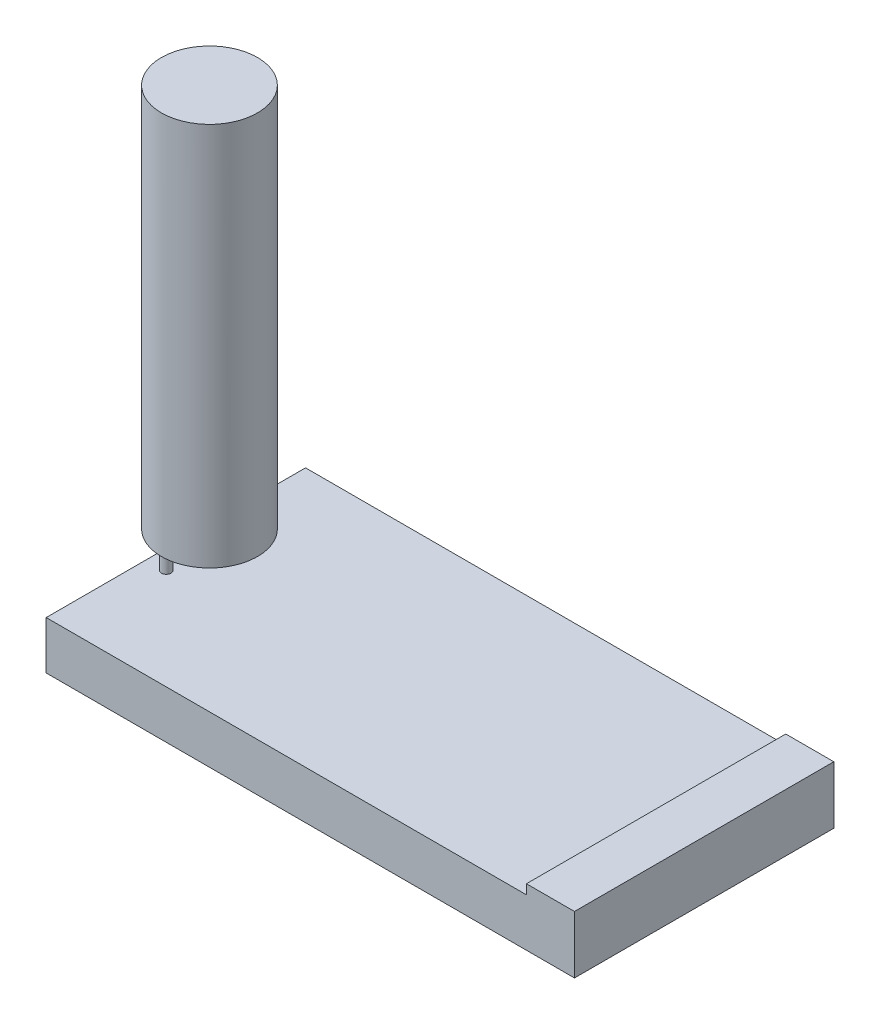
ISO-10303-21;
HEADER;
FILE_DESCRIPTION(('STEP AP214'),'2;1');
FILE_NAME('part.step','',(''),(''),'','','');
FILE_SCHEMA(('AUTOMOTIVE_DESIGN { 1 0 10303 214 1 1 1 1 }'));
ENDSEC;
DATA;
#1=APPLICATION_CONTEXT('core data for automotive mechanical design processes');
#2=APPLICATION_PROTOCOL_DEFINITION('international standard','automotive_design',2000,#1);
#3=PRODUCT_CONTEXT('',#1,'mechanical');
#4=PRODUCT('Part','Part','',(#3));
#5=PRODUCT_RELATED_PRODUCT_CATEGORY('part','',(#4));
#6=PRODUCT_DEFINITION_FORMATION('','',#4);
#7=PRODUCT_DEFINITION_CONTEXT('part definition',#1,'design');
#8=PRODUCT_DEFINITION('design','',#6,#7);
#9=PRODUCT_DEFINITION_SHAPE('','',#8);
#10=(LENGTH_UNIT() NAMED_UNIT(*) SI_UNIT(.MILLI.,.METRE.));
#11=(NAMED_UNIT(*) PLANE_ANGLE_UNIT() SI_UNIT($,.RADIAN.));
#12=(NAMED_UNIT(*) SI_UNIT($,.STERADIAN.) SOLID_ANGLE_UNIT());
#13=UNCERTAINTY_MEASURE_WITH_UNIT(LENGTH_MEASURE(1.E-05),#10,'distance_accuracy_value','');
#14=(GEOMETRIC_REPRESENTATION_CONTEXT(3) GLOBAL_UNCERTAINTY_ASSIGNED_CONTEXT((#13)) GLOBAL_UNIT_ASSIGNED_CONTEXT((#10,
#11,#12)) REPRESENTATION_CONTEXT('',''));
#15=CARTESIAN_POINT('',(0.,0.,0.));
#16=DIRECTION('',(0.,0.,1.));
#17=DIRECTION('',(1.,0.,0.));
#18=AXIS2_PLACEMENT_3D('',#15,#16,#17);
#19=CARTESIAN_POINT('',(13.75,2.5,6.75));
#20=DIRECTION('',(-1.,0.,0.));
#21=DIRECTION('',(0.,0.,1.));
#22=AXIS2_PLACEMENT_3D('',#19,#20,#21);
#23=PLANE('',#22);
#24=DIRECTION('',(0.,0.,-1.));
#25=VECTOR('',#24,1.);
#26=CARTESIAN_POINT('',(13.75,0.,6.75));
#27=LINE('',#26,#25);
#28=CARTESIAN_POINT('',(13.75,0.,6.75));
#29=VERTEX_POINT('',#28);
#30=CARTESIAN_POINT('',(13.75,0.,-6.75));
#31=VERTEX_POINT('',#30);
#32=EDGE_CURVE('E109',#29,#31,#27,.T.);
#33=ORIENTED_EDGE('',*,*,#32,.T.);
#34=DIRECTION('',(0.,-1.,0.));
#35=VECTOR('',#34,1.);
#36=CARTESIAN_POINT('',(13.75,2.5,-6.75));
#37=LINE('',#36,#35);
#38=CARTESIAN_POINT('',(13.75,3.,-6.75));
#39=VERTEX_POINT('',#38);
#40=EDGE_CURVE('E53',#39,#31,#37,.T.);
#41=ORIENTED_EDGE('',*,*,#40,.F.);
#42=DIRECTION('',(0.,0.,1.));
#43=VECTOR('',#42,1.);
#44=CARTESIAN_POINT('',(13.75,3.,0.));
#45=LINE('',#44,#43);
#46=CARTESIAN_POINT('',(13.75,3.,6.75));
#47=VERTEX_POINT('',#46);
#48=EDGE_CURVE('E111',#39,#47,#45,.T.);
#49=ORIENTED_EDGE('',*,*,#48,.T.);
#50=DIRECTION('',(0.,-1.,0.));
#51=VECTOR('',#50,1.);
#52=CARTESIAN_POINT('',(13.75,2.5,6.75));
#53=LINE('',#52,#51);
#54=EDGE_CURVE('E94',#47,#29,#53,.T.);
#55=ORIENTED_EDGE('',*,*,#54,.T.);
#56=EDGE_LOOP('',(#33,#41,#49,#55));
#57=FACE_BOUND('',#56,.T.);
#58=ADVANCED_FACE('F45',(#57),#23,.F.);
#59=CARTESIAN_POINT('',(-13.75,2.5,-6.75));
#60=DIRECTION('',(0.,0.,1.));
#61=DIRECTION('',(1.,0.,0.));
#62=AXIS2_PLACEMENT_3D('',#59,#60,#61);
#63=PLANE('',#62);
#64=DIRECTION('',(-1.,0.,0.));
#65=VECTOR('',#64,1.);
#66=CARTESIAN_POINT('',(-13.75,2.5,-6.75));
#67=LINE('',#66,#65);
#68=CARTESIAN_POINT('',(11.25,2.5,-6.75));
#69=VERTEX_POINT('',#68);
#70=CARTESIAN_POINT('',(-13.75,2.5,-6.75));
#71=VERTEX_POINT('',#70);
#72=EDGE_CURVE('E102',#69,#71,#67,.T.);
#73=ORIENTED_EDGE('',*,*,#72,.F.);
#74=DIRECTION('',(0.,-1.,0.));
#75=VECTOR('',#74,1.);
#76=CARTESIAN_POINT('',(11.25,3.,-6.75));
#77=LINE('',#76,#75);
#78=CARTESIAN_POINT('',(11.25,3.,-6.75));
#79=VERTEX_POINT('',#78);
#80=EDGE_CURVE('E60',#79,#69,#77,.T.);
#81=ORIENTED_EDGE('',*,*,#80,.F.);
#82=DIRECTION('',(1.,0.,0.));
#83=VECTOR('',#82,1.);
#84=CARTESIAN_POINT('',(0.,3.,-6.75));
#85=LINE('',#84,#83);
#86=EDGE_CURVE('E143',#79,#39,#85,.T.);
#87=ORIENTED_EDGE('',*,*,#86,.T.);
#88=ORIENTED_EDGE('',*,*,#40,.T.);
#89=DIRECTION('',(-1.,0.,0.));
#90=VECTOR('',#89,1.);
#91=CARTESIAN_POINT('',(-13.75,0.,-6.75));
#92=LINE('',#91,#90);
#93=CARTESIAN_POINT('',(-13.75,0.,-6.75));
#94=VERTEX_POINT('',#93);
#95=EDGE_CURVE('E116',#31,#94,#92,.T.);
#96=ORIENTED_EDGE('',*,*,#95,.T.);
#97=DIRECTION('',(0.,-1.,0.));
#98=VECTOR('',#97,1.);
#99=CARTESIAN_POINT('',(-13.75,2.5,-6.75));
#100=LINE('',#99,#98);
#101=EDGE_CURVE('E132',#71,#94,#100,.T.);
#102=ORIENTED_EDGE('',*,*,#101,.F.);
#103=EDGE_LOOP('',(#73,#81,#87,#88,#96,#102));
#104=FACE_BOUND('',#103,.T.);
#105=ADVANCED_FACE('F139',(#104),#63,.F.);
#106=CARTESIAN_POINT('',(-13.75,2.5,6.75));
#107=DIRECTION('',(1.,0.,0.));
#108=DIRECTION('',(0.,0.,-1.));
#109=AXIS2_PLACEMENT_3D('',#106,#107,#108);
#110=PLANE('',#109);
#111=DIRECTION('',(0.,0.,1.));
#112=VECTOR('',#111,1.);
#113=CARTESIAN_POINT('',(-13.75,0.,6.75));
#114=LINE('',#113,#112);
#115=CARTESIAN_POINT('',(-13.75,0.,6.75));
#116=VERTEX_POINT('',#115);
#117=EDGE_CURVE('E103',#94,#116,#114,.T.);
#118=ORIENTED_EDGE('',*,*,#117,.T.);
#119=DIRECTION('',(0.,-1.,0.));
#120=VECTOR('',#119,1.);
#121=CARTESIAN_POINT('',(-13.75,2.5,6.75));
#122=LINE('',#121,#120);
#123=CARTESIAN_POINT('',(-13.75,2.5,6.75));
#124=VERTEX_POINT('',#123);
#125=EDGE_CURVE('E97',#124,#116,#122,.T.);
#126=ORIENTED_EDGE('',*,*,#125,.F.);
#127=DIRECTION('',(0.,0.,1.));
#128=VECTOR('',#127,1.);
#129=CARTESIAN_POINT('',(-13.75,2.5,6.75));
#130=LINE('',#129,#128);
#131=EDGE_CURVE('E69',#71,#124,#130,.T.);
#132=ORIENTED_EDGE('',*,*,#131,.F.);
#133=ORIENTED_EDGE('',*,*,#101,.T.);
#134=EDGE_LOOP('',(#118,#126,#132,#133));
#135=FACE_BOUND('',#134,.T.);
#136=ADVANCED_FACE('F215',(#135),#110,.F.);
#137=CARTESIAN_POINT('',(-13.75,2.5,6.75));
#138=DIRECTION('',(0.,0.,-1.));
#139=DIRECTION('',(-1.,0.,0.));
#140=AXIS2_PLACEMENT_3D('',#137,#138,#139);
#141=PLANE('',#140);
#142=DIRECTION('',(1.,0.,0.));
#143=VECTOR('',#142,1.);
#144=CARTESIAN_POINT('',(-13.75,0.,6.75));
#145=LINE('',#144,#143);
#146=EDGE_CURVE('E89',#116,#29,#145,.T.);
#147=ORIENTED_EDGE('',*,*,#146,.T.);
#148=ORIENTED_EDGE('',*,*,#54,.F.);
#149=DIRECTION('',(-1.,0.,0.));
#150=VECTOR('',#149,1.);
#151=CARTESIAN_POINT('',(0.,3.,6.75));
#152=LINE('',#151,#150);
#153=CARTESIAN_POINT('',(11.25,3.,6.75));
#154=VERTEX_POINT('',#153);
#155=EDGE_CURVE('E155',#47,#154,#152,.T.);
#156=ORIENTED_EDGE('',*,*,#155,.T.);
#157=DIRECTION('',(0.,-1.,0.));
#158=VECTOR('',#157,1.);
#159=CARTESIAN_POINT('',(11.25,3.,6.75));
#160=LINE('',#159,#158);
#161=CARTESIAN_POINT('',(11.25,2.5,6.75));
#162=VERTEX_POINT('',#161);
#163=EDGE_CURVE('E153',#154,#162,#160,.T.);
#164=ORIENTED_EDGE('',*,*,#163,.T.);
#165=DIRECTION('',(1.,0.,0.));
#166=VECTOR('',#165,1.);
#167=CARTESIAN_POINT('',(-13.75,2.5,6.75));
#168=LINE('',#167,#166);
#169=EDGE_CURVE('E113',#124,#162,#168,.T.);
#170=ORIENTED_EDGE('',*,*,#169,.F.);
#171=ORIENTED_EDGE('',*,*,#125,.T.);
#172=EDGE_LOOP('',(#147,#148,#156,#164,#170,#171));
#173=FACE_BOUND('',#172,.T.);
#174=ADVANCED_FACE('F91',(#173),#141,.F.);
#175=CARTESIAN_POINT('',(0.,2.5,0.));
#176=DIRECTION('',(0.,-1.,0.));
#177=DIRECTION('',(0.,0.,-1.));
#178=AXIS2_PLACEMENT_3D('',#175,#176,#177);
#179=PLANE('',#178);
#180=CARTESIAN_POINT('',(-12.75,2.5,1.5));
#181=DIRECTION('',(0.,-1.,0.));
#182=DIRECTION('',(0.,0.,-1.));
#183=AXIS2_PLACEMENT_3D('',#180,#181,#182);
#184=CIRCLE('',#183,0.25);
#185=CARTESIAN_POINT('',(-12.75,2.5,1.25));
#186=VERTEX_POINT('',#185);
#187=EDGE_CURVE('E11',#186,#186,#184,.F.);
#188=ORIENTED_EDGE('',*,*,#187,.F.);
#189=EDGE_LOOP('',(#188));
#190=FACE_BOUND('',#189,.T.);
#191=ORIENTED_EDGE('',*,*,#169,.T.);
#192=DIRECTION('',(0.,0.,-1.));
#193=VECTOR('',#192,1.);
#194=CARTESIAN_POINT('',(11.25,2.5,0.));
#195=LINE('',#194,#193);
#196=EDGE_CURVE('E119',#162,#69,#195,.T.);
#197=ORIENTED_EDGE('',*,*,#196,.T.);
#198=ORIENTED_EDGE('',*,*,#72,.T.);
#199=ORIENTED_EDGE('',*,*,#131,.T.);
#200=EDGE_LOOP('',(#191,#197,#198,#199));
#201=FACE_BOUND('',#200,.T.);
#202=ADVANCED_FACE('F158',(#190,#201),#179,.F.);
#203=CARTESIAN_POINT('',(0.,0.,0.));
#204=DIRECTION('',(0.,-1.,0.));
#205=DIRECTION('',(0.,0.,-1.));
#206=AXIS2_PLACEMENT_3D('',#203,#204,#205);
#207=PLANE('',#206);
#208=ORIENTED_EDGE('',*,*,#117,.F.);
#209=ORIENTED_EDGE('',*,*,#95,.F.);
#210=ORIENTED_EDGE('',*,*,#32,.F.);
#211=ORIENTED_EDGE('',*,*,#146,.F.);
#212=EDGE_LOOP('',(#208,#209,#210,#211));
#213=FACE_BOUND('',#212,.T.);
#214=ADVANCED_FACE('F115',(#213),#207,.T.);
#215=CARTESIAN_POINT('',(11.25,3.,0.));
#216=DIRECTION('',(-1.,0.,0.));
#217=DIRECTION('',(0.,0.,1.));
#218=AXIS2_PLACEMENT_3D('',#215,#216,#217);
#219=PLANE('',#218);
#220=ORIENTED_EDGE('',*,*,#196,.F.);
#221=ORIENTED_EDGE('',*,*,#163,.F.);
#222=DIRECTION('',(0.,0.,-1.));
#223=VECTOR('',#222,1.);
#224=CARTESIAN_POINT('',(11.25,3.,0.));
#225=LINE('',#224,#223);
#226=EDGE_CURVE('E170',#154,#79,#225,.T.);
#227=ORIENTED_EDGE('',*,*,#226,.T.);
#228=ORIENTED_EDGE('',*,*,#80,.T.);
#229=EDGE_LOOP('',(#220,#221,#227,#228));
#230=FACE_BOUND('',#229,.T.);
#231=ADVANCED_FACE('F152',(#230),#219,.T.);
#232=CARTESIAN_POINT('',(0.,3.,0.));
#233=DIRECTION('',(0.,-1.,0.));
#234=DIRECTION('',(0.,0.,-1.));
#235=AXIS2_PLACEMENT_3D('',#232,#233,#234);
#236=PLANE('',#235);
#237=ORIENTED_EDGE('',*,*,#155,.F.);
#238=ORIENTED_EDGE('',*,*,#48,.F.);
#239=ORIENTED_EDGE('',*,*,#86,.F.);
#240=ORIENTED_EDGE('',*,*,#226,.F.);
#241=EDGE_LOOP('',(#237,#238,#239,#240));
#242=FACE_BOUND('',#241,.T.);
#243=ADVANCED_FACE('F204',(#242),#236,.F.);
#244=CARTESIAN_POINT('',(-12.75,5.5,1.5));
#245=DIRECTION('',(0.,-1.,0.));
#246=DIRECTION('',(0.,0.,-1.));
#247=AXIS2_PLACEMENT_3D('',#244,#245,#246);
#248=CYLINDRICAL_SURFACE('',#247,0.25);
#249=CARTESIAN_POINT('',(-12.75,5.5,1.5));
#250=DIRECTION('',(0.,1.,0.));
#251=DIRECTION('',(0.,0.,1.));
#252=AXIS2_PLACEMENT_3D('',#249,#250,#251);
#253=CIRCLE('',#252,0.25);
#254=CARTESIAN_POINT('',(-13.,5.5,1.5));
#255=VERTEX_POINT('',#254);
#256=EDGE_CURVE('E175',#255,#255,#253,.T.);
#257=ORIENTED_EDGE('',*,*,#256,.F.);
#258=EDGE_LOOP('',(#257));
#259=FACE_BOUND('',#258,.T.);
#260=ORIENTED_EDGE('',*,*,#187,.T.);
#261=EDGE_LOOP('',(#260));
#262=FACE_BOUND('',#261,.T.);
#263=ADVANCED_FACE('F193',(#259,#262),#248,.T.);
#264=CARTESIAN_POINT('',(-10.5,25.5,1.5));
#265=DIRECTION('',(0.,-1.,0.));
#266=DIRECTION('',(0.,0.,-1.));
#267=AXIS2_PLACEMENT_3D('',#264,#265,#266);
#268=CYLINDRICAL_SURFACE('',#267,2.5);
#269=CARTESIAN_POINT('',(-10.5,25.5,1.5));
#270=DIRECTION('',(0.,1.,0.));
#271=DIRECTION('',(0.,0.,1.));
#272=AXIS2_PLACEMENT_3D('',#269,#270,#271);
#273=CIRCLE('',#272,2.5);
#274=CARTESIAN_POINT('',(-10.5,25.5,4.));
#275=VERTEX_POINT('',#274);
#276=EDGE_CURVE('E179',#275,#275,#273,.T.);
#277=ORIENTED_EDGE('',*,*,#276,.F.);
#278=EDGE_LOOP('',(#277));
#279=FACE_BOUND('',#278,.T.);
#280=CARTESIAN_POINT('',(-10.5,5.5,1.5));
#281=DIRECTION('',(0.,1.,0.));
#282=DIRECTION('',(0.,0.,1.));
#283=AXIS2_PLACEMENT_3D('',#280,#281,#282);
#284=CIRCLE('',#283,2.5);
#285=EDGE_CURVE('E180',#255,#255,#284,.T.);
#286=ORIENTED_EDGE('',*,*,#285,.T.);
#287=EDGE_LOOP('',(#286));
#288=FACE_BOUND('',#287,.T.);
#289=ADVANCED_FACE('F190',(#279,#288),#268,.T.);
#290=CARTESIAN_POINT('',(-10.5,25.5,1.5));
#291=DIRECTION('',(0.,1.,0.));
#292=DIRECTION('',(0.,0.,1.));
#293=AXIS2_PLACEMENT_3D('',#290,#291,#292);
#294=PLANE('',#293);
#295=ORIENTED_EDGE('',*,*,#276,.T.);
#296=EDGE_LOOP('',(#295));
#297=FACE_BOUND('',#296,.T.);
#298=ADVANCED_FACE('F188',(#297),#294,.T.);
#299=CARTESIAN_POINT('',(-10.5,5.5,1.5));
#300=DIRECTION('',(0.,1.,0.));
#301=DIRECTION('',(0.,0.,1.));
#302=AXIS2_PLACEMENT_3D('',#299,#300,#301);
#303=PLANE('',#302);
#304=ORIENTED_EDGE('',*,*,#285,.F.);
#305=ORIENTED_EDGE('',*,*,#256,.T.);
#306=EDGE_LOOP('',(#304,#305));
#307=FACE_BOUND('',#306,.T.);
#308=ADVANCED_FACE('F200',(#307),#303,.F.);
#309=CLOSED_SHELL('',(#58,#105,#136,#174,#202,#214,#231,#243,#263,#289,#298,#308));
#310=MANIFOLD_SOLID_BREP('B2',#309);
#311=ADVANCED_BREP_SHAPE_REPRESENTATION('',(#18,#310),#14);
#312=SHAPE_DEFINITION_REPRESENTATION(#9,#311);
ENDSEC;
END-ISO-10303-21;
